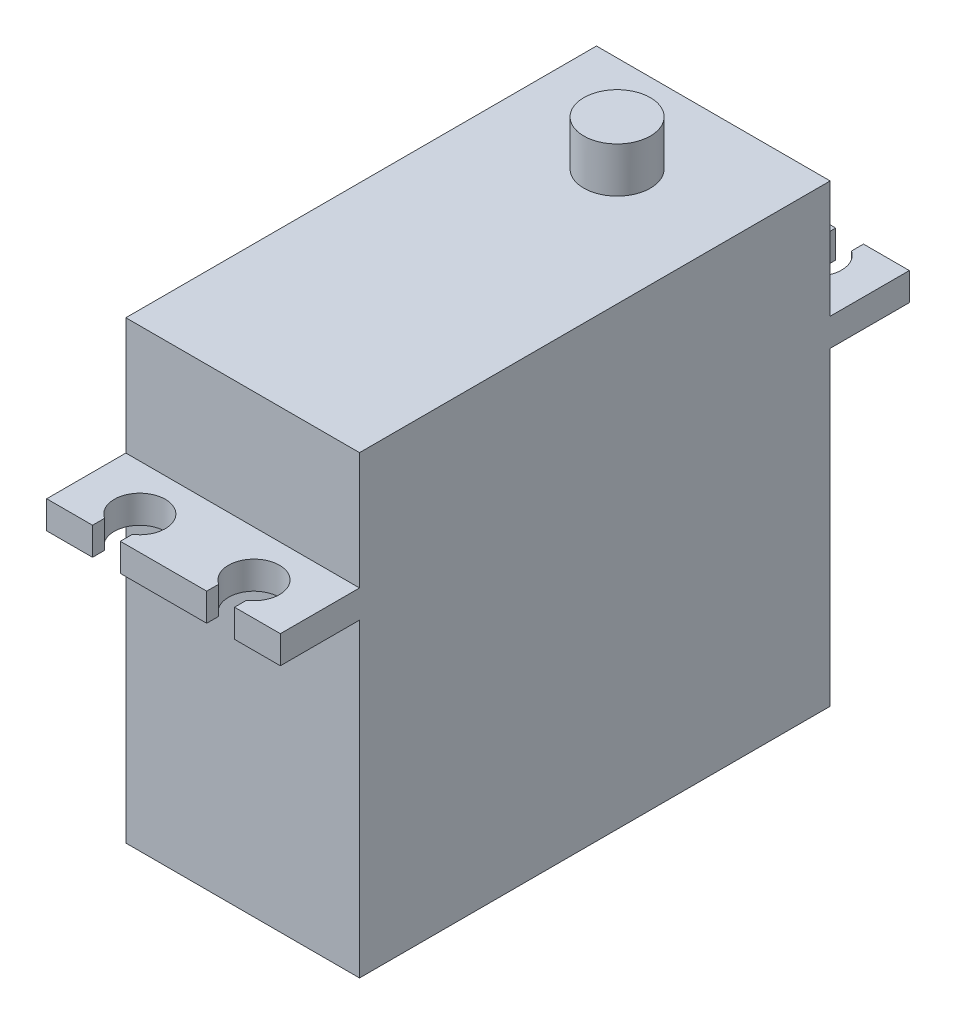
ISO-10303-21;
HEADER;
FILE_DESCRIPTION(('STEP AP214'),'2;1');
FILE_NAME('part.step','',(''),(''),'','','');
FILE_SCHEMA(('AUTOMOTIVE_DESIGN { 1 0 10303 214 1 1 1 1 }'));
ENDSEC;
DATA;
#1=APPLICATION_CONTEXT('core data for automotive mechanical design processes');
#2=APPLICATION_PROTOCOL_DEFINITION('international standard','automotive_design',2000,#1);
#3=PRODUCT_CONTEXT('',#1,'mechanical');
#4=PRODUCT('Part','Part','',(#3));
#5=PRODUCT_RELATED_PRODUCT_CATEGORY('part','',(#4));
#6=PRODUCT_DEFINITION_FORMATION('','',#4);
#7=PRODUCT_DEFINITION_CONTEXT('part definition',#1,'design');
#8=PRODUCT_DEFINITION('design','',#6,#7);
#9=PRODUCT_DEFINITION_SHAPE('','',#8);
#10=(LENGTH_UNIT() NAMED_UNIT(*) SI_UNIT(.MILLI.,.METRE.));
#11=(NAMED_UNIT(*) PLANE_ANGLE_UNIT() SI_UNIT($,.RADIAN.));
#12=(NAMED_UNIT(*) SI_UNIT($,.STERADIAN.) SOLID_ANGLE_UNIT());
#13=UNCERTAINTY_MEASURE_WITH_UNIT(LENGTH_MEASURE(1.E-05),#10,'distance_accuracy_value','');
#14=(GEOMETRIC_REPRESENTATION_CONTEXT(3) GLOBAL_UNCERTAINTY_ASSIGNED_CONTEXT((#13)) GLOBAL_UNIT_ASSIGNED_CONTEXT((#10,
#11,#12)) REPRESENTATION_CONTEXT('',''));
#15=CARTESIAN_POINT('',(0.,0.,0.));
#16=DIRECTION('',(0.,0.,1.));
#17=DIRECTION('',(1.,0.,0.));
#18=AXIS2_PLACEMENT_3D('',#15,#16,#17);
#19=CARTESIAN_POINT('',(10.08,39.25,-20.3));
#20=DIRECTION('',(0.,-1.,0.));
#21=DIRECTION('',(0.,0.,-1.));
#22=AXIS2_PLACEMENT_3D('',#19,#20,#21);
#23=PLANE('',#22);
#24=DIRECTION('',(0.,0.,1.));
#25=VECTOR('',#24,1.);
#26=CARTESIAN_POINT('',(-10.08,39.25,-20.3));
#27=LINE('',#26,#25);
#28=CARTESIAN_POINT('',(-10.08,39.25,-20.3));
#29=VERTEX_POINT('',#28);
#30=CARTESIAN_POINT('',(-10.08,39.25,20.3));
#31=VERTEX_POINT('',#30);
#32=EDGE_CURVE('E449',#29,#31,#27,.T.);
#33=ORIENTED_EDGE('',*,*,#32,.T.);
#34=DIRECTION('',(-1.,0.,0.));
#35=VECTOR('',#34,1.);
#36=CARTESIAN_POINT('',(10.08,39.25,20.3));
#37=LINE('',#36,#35);
#38=CARTESIAN_POINT('',(10.08,39.25,20.3));
#39=VERTEX_POINT('',#38);
#40=EDGE_CURVE('E465',#39,#31,#37,.T.);
#41=ORIENTED_EDGE('',*,*,#40,.F.);
#42=DIRECTION('',(0.,0.,1.));
#43=VECTOR('',#42,1.);
#44=CARTESIAN_POINT('',(10.08,39.25,-20.3));
#45=LINE('',#44,#43);
#46=CARTESIAN_POINT('',(10.08,39.25,-20.3));
#47=VERTEX_POINT('',#46);
#48=EDGE_CURVE('E437',#47,#39,#45,.T.);
#49=ORIENTED_EDGE('',*,*,#48,.F.);
#50=DIRECTION('',(-1.,0.,0.));
#51=VECTOR('',#50,1.);
#52=CARTESIAN_POINT('',(10.08,39.25,-20.3));
#53=LINE('',#52,#51);
#54=EDGE_CURVE('E40',#47,#29,#53,.T.);
#55=ORIENTED_EDGE('',*,*,#54,.T.);
#56=EDGE_LOOP('',(#33,#41,#49,#55));
#57=FACE_BOUND('',#56,.T.);
#58=CARTESIAN_POINT('',(0.,39.25,-12.));
#59=DIRECTION('',(0.,-1.,0.));
#60=DIRECTION('',(0.,0.,-1.));
#61=AXIS2_PLACEMENT_3D('',#58,#59,#60);
#62=CIRCLE('',#61,2.87);
#63=CARTESIAN_POINT('',(0.,39.25,-14.87));
#64=VERTEX_POINT('',#63);
#65=EDGE_CURVE('E11',#64,#64,#62,.F.);
#66=ORIENTED_EDGE('',*,*,#65,.F.);
#67=EDGE_LOOP('',(#66));
#68=FACE_BOUND('',#67,.T.);
#69=ADVANCED_FACE('F32',(#57,#68),#23,.F.);
#70=CARTESIAN_POINT('',(10.08,0.,-20.3));
#71=DIRECTION('',(0.,0.,1.));
#72=DIRECTION('',(1.,0.,0.));
#73=AXIS2_PLACEMENT_3D('',#70,#71,#72);
#74=PLANE('',#73);
#75=DIRECTION('',(-1.,0.,0.));
#76=VECTOR('',#75,1.);
#77=CARTESIAN_POINT('',(-10.08,26.74,-20.3));
#78=LINE('',#77,#76);
#79=CARTESIAN_POINT('',(10.08,26.74,-20.3));
#80=VERTEX_POINT('',#79);
#81=CARTESIAN_POINT('',(-10.08,26.74,-20.3));
#82=VERTEX_POINT('',#81);
#83=EDGE_CURVE('E276',#80,#82,#78,.T.);
#84=ORIENTED_EDGE('',*,*,#83,.F.);
#85=DIRECTION('',(0.,1.,0.));
#86=VECTOR('',#85,1.);
#87=CARTESIAN_POINT('',(10.08,0.,-20.3));
#88=LINE('',#87,#86);
#89=CARTESIAN_POINT('',(10.08,0.,-20.3));
#90=VERTEX_POINT('',#89);
#91=EDGE_CURVE('E439',#90,#80,#88,.T.);
#92=ORIENTED_EDGE('',*,*,#91,.F.);
#93=DIRECTION('',(-1.,0.,0.));
#94=VECTOR('',#93,1.);
#95=CARTESIAN_POINT('',(10.08,0.,-20.3));
#96=LINE('',#95,#94);
#97=CARTESIAN_POINT('',(-10.08,0.,-20.3));
#98=VERTEX_POINT('',#97);
#99=EDGE_CURVE('E470',#90,#98,#96,.T.);
#100=ORIENTED_EDGE('',*,*,#99,.T.);
#101=DIRECTION('',(0.,1.,0.));
#102=VECTOR('',#101,1.);
#103=CARTESIAN_POINT('',(-10.08,0.,-20.3));
#104=LINE('',#103,#102);
#105=EDGE_CURVE('E444',#98,#82,#104,.T.);
#106=ORIENTED_EDGE('',*,*,#105,.T.);
#107=EDGE_LOOP('',(#84,#92,#100,#106));
#108=FACE_BOUND('',#107,.T.);
#109=DIRECTION('',(0.,1.,0.));
#110=VECTOR('',#109,1.);
#111=CARTESIAN_POINT('',(-3.2,7.57434940805922,-20.3));
#112=LINE('',#111,#110);
#113=CARTESIAN_POINT('',(-3.2,3.47434940805923,-20.3));
#114=VERTEX_POINT('',#113);
#115=CARTESIAN_POINT('',(-3.2,7.57434940805922,-20.3));
#116=VERTEX_POINT('',#115);
#117=EDGE_CURVE('E261',#114,#116,#112,.T.);
#118=ORIENTED_EDGE('',*,*,#117,.F.);
#119=DIRECTION('',(-1.,0.,0.));
#120=VECTOR('',#119,1.);
#121=CARTESIAN_POINT('',(-3.2,3.47434940805923,-20.3));
#122=LINE('',#121,#120);
#123=CARTESIAN_POINT('',(3.2,3.47434940805922,-20.3));
#124=VERTEX_POINT('',#123);
#125=EDGE_CURVE('E258',#124,#114,#122,.T.);
#126=ORIENTED_EDGE('',*,*,#125,.F.);
#127=DIRECTION('',(0.,-1.,0.));
#128=VECTOR('',#127,1.);
#129=CARTESIAN_POINT('',(3.2,7.57434940805922,-20.3));
#130=LINE('',#129,#128);
#131=CARTESIAN_POINT('',(3.2,7.57434940805922,-20.3));
#132=VERTEX_POINT('',#131);
#133=EDGE_CURVE('E52',#132,#124,#130,.T.);
#134=ORIENTED_EDGE('',*,*,#133,.F.);
#135=DIRECTION('',(1.,0.,0.));
#136=VECTOR('',#135,1.);
#137=CARTESIAN_POINT('',(-3.2,7.57434940805922,-20.3));
#138=LINE('',#137,#136);
#139=EDGE_CURVE('E47',#116,#132,#138,.T.);
#140=ORIENTED_EDGE('',*,*,#139,.F.);
#141=EDGE_LOOP('',(#118,#126,#134,#140));
#142=FACE_BOUND('',#141,.T.);
#143=ADVANCED_FACE('F564',(#108,#142),#74,.F.);
#144=CARTESIAN_POINT('',(10.08,0.,20.3));
#145=DIRECTION('',(0.,0.,-1.));
#146=DIRECTION('',(-1.,0.,0.));
#147=AXIS2_PLACEMENT_3D('',#144,#145,#146);
#148=PLANE('',#147);
#149=DIRECTION('',(-1.,0.,0.));
#150=VECTOR('',#149,1.);
#151=CARTESIAN_POINT('',(-10.08,29.14,20.3));
#152=LINE('',#151,#150);
#153=CARTESIAN_POINT('',(10.08,29.14,20.3));
#154=VERTEX_POINT('',#153);
#155=CARTESIAN_POINT('',(-10.08,29.14,20.3));
#156=VERTEX_POINT('',#155);
#157=EDGE_CURVE('E397',#154,#156,#152,.T.);
#158=ORIENTED_EDGE('',*,*,#157,.F.);
#159=DIRECTION('',(0.,-1.,0.));
#160=VECTOR('',#159,1.);
#161=CARTESIAN_POINT('',(10.08,0.,20.3));
#162=LINE('',#161,#160);
#163=EDGE_CURVE('E476',#39,#154,#162,.T.);
#164=ORIENTED_EDGE('',*,*,#163,.F.);
#165=ORIENTED_EDGE('',*,*,#40,.T.);
#166=DIRECTION('',(0.,-1.,0.));
#167=VECTOR('',#166,1.);
#168=CARTESIAN_POINT('',(-10.08,0.,20.3));
#169=LINE('',#168,#167);
#170=EDGE_CURVE('E460',#31,#156,#169,.T.);
#171=ORIENTED_EDGE('',*,*,#170,.T.);
#172=EDGE_LOOP('',(#158,#164,#165,#171));
#173=FACE_BOUND('',#172,.T.);
#174=ADVANCED_FACE('F496',(#173),#148,.F.);
#175=CARTESIAN_POINT('',(10.08,29.14,-20.3));
#176=VERTEX_POINT('',#175);
#177=EDGE_CURVE('E282',#176,#47,#88,.T.);
#178=ORIENTED_EDGE('',*,*,#177,.F.);
#179=DIRECTION('',(-1.,0.,0.));
#180=VECTOR('',#179,1.);
#181=CARTESIAN_POINT('',(-10.08,29.14,-20.3));
#182=LINE('',#181,#180);
#183=CARTESIAN_POINT('',(-10.08,29.14,-20.3));
#184=VERTEX_POINT('',#183);
#185=EDGE_CURVE('E265',#176,#184,#182,.T.);
#186=ORIENTED_EDGE('',*,*,#185,.T.);
#187=EDGE_CURVE('E418',#184,#29,#104,.T.);
#188=ORIENTED_EDGE('',*,*,#187,.T.);
#189=ORIENTED_EDGE('',*,*,#54,.F.);
#190=EDGE_LOOP('',(#178,#186,#188,#189));
#191=FACE_BOUND('',#190,.T.);
#192=ADVANCED_FACE('F34',(#191),#74,.F.);
#193=CARTESIAN_POINT('',(10.08,26.74,20.3));
#194=VERTEX_POINT('',#193);
#195=CARTESIAN_POINT('',(10.08,0.,20.3));
#196=VERTEX_POINT('',#195);
#197=EDGE_CURVE('E392',#194,#196,#162,.T.);
#198=ORIENTED_EDGE('',*,*,#197,.F.);
#199=DIRECTION('',(-1.,0.,0.));
#200=VECTOR('',#199,1.);
#201=CARTESIAN_POINT('',(-10.08,26.74,20.3));
#202=LINE('',#201,#200);
#203=CARTESIAN_POINT('',(-10.08,26.74,20.3));
#204=VERTEX_POINT('',#203);
#205=EDGE_CURVE('E387',#194,#204,#202,.T.);
#206=ORIENTED_EDGE('',*,*,#205,.T.);
#207=CARTESIAN_POINT('',(-10.08,0.,20.3));
#208=VERTEX_POINT('',#207);
#209=EDGE_CURVE('E452',#204,#208,#169,.T.);
#210=ORIENTED_EDGE('',*,*,#209,.T.);
#211=DIRECTION('',(-1.,0.,0.));
#212=VECTOR('',#211,1.);
#213=CARTESIAN_POINT('',(10.08,0.,20.3));
#214=LINE('',#213,#212);
#215=EDGE_CURVE('E468',#196,#208,#214,.T.);
#216=ORIENTED_EDGE('',*,*,#215,.F.);
#217=EDGE_LOOP('',(#198,#206,#210,#216));
#218=FACE_BOUND('',#217,.T.);
#219=ADVANCED_FACE('F561',(#218),#148,.F.);
#220=CARTESIAN_POINT('',(10.08,0.,-20.3));
#221=DIRECTION('',(0.,1.,0.));
#222=DIRECTION('',(0.,0.,1.));
#223=AXIS2_PLACEMENT_3D('',#220,#221,#222);
#224=PLANE('',#223);
#225=DIRECTION('',(0.,0.,-1.));
#226=VECTOR('',#225,1.);
#227=CARTESIAN_POINT('',(-10.08,0.,-20.3));
#228=LINE('',#227,#226);
#229=EDGE_CURVE('E455',#208,#98,#228,.T.);
#230=ORIENTED_EDGE('',*,*,#229,.T.);
#231=ORIENTED_EDGE('',*,*,#99,.F.);
#232=DIRECTION('',(0.,0.,-1.));
#233=VECTOR('',#232,1.);
#234=CARTESIAN_POINT('',(10.08,0.,-20.3));
#235=LINE('',#234,#233);
#236=EDGE_CURVE('E448',#196,#90,#235,.T.);
#237=ORIENTED_EDGE('',*,*,#236,.F.);
#238=ORIENTED_EDGE('',*,*,#215,.T.);
#239=EDGE_LOOP('',(#230,#231,#237,#238));
#240=FACE_BOUND('',#239,.T.);
#241=ADVANCED_FACE('F563',(#240),#224,.F.);
#242=CARTESIAN_POINT('',(10.08,0.,0.));
#243=DIRECTION('',(1.,0.,0.));
#244=DIRECTION('',(0.,0.,-1.));
#245=AXIS2_PLACEMENT_3D('',#242,#243,#244);
#246=PLANE('',#245);
#247=ORIENTED_EDGE('',*,*,#91,.T.);
#248=DIRECTION('',(0.,0.,1.));
#249=VECTOR('',#248,1.);
#250=CARTESIAN_POINT('',(10.08,26.74,-20.3));
#251=LINE('',#250,#249);
#252=CARTESIAN_POINT('',(10.08,26.74,-27.13));
#253=VERTEX_POINT('',#252);
#254=EDGE_CURVE('E280',#253,#80,#251,.T.);
#255=ORIENTED_EDGE('',*,*,#254,.F.);
#256=DIRECTION('',(0.,1.,0.));
#257=VECTOR('',#256,1.);
#258=CARTESIAN_POINT('',(10.08,26.74,-27.13));
#259=LINE('',#258,#257);
#260=CARTESIAN_POINT('',(10.08,29.14,-27.13));
#261=VERTEX_POINT('',#260);
#262=EDGE_CURVE('E350',#253,#261,#259,.T.);
#263=ORIENTED_EDGE('',*,*,#262,.T.);
#264=DIRECTION('',(0.,0.,1.));
#265=VECTOR('',#264,1.);
#266=CARTESIAN_POINT('',(10.08,29.14,-20.3));
#267=LINE('',#266,#265);
#268=EDGE_CURVE('E294',#261,#176,#267,.T.);
#269=ORIENTED_EDGE('',*,*,#268,.T.);
#270=ORIENTED_EDGE('',*,*,#177,.T.);
#271=ORIENTED_EDGE('',*,*,#48,.T.);
#272=ORIENTED_EDGE('',*,*,#163,.T.);
#273=DIRECTION('',(0.,0.,-1.));
#274=VECTOR('',#273,1.);
#275=CARTESIAN_POINT('',(10.08,29.14,20.3));
#276=LINE('',#275,#274);
#277=CARTESIAN_POINT('',(10.08,29.14,27.13));
#278=VERTEX_POINT('',#277);
#279=EDGE_CURVE('E403',#278,#154,#276,.T.);
#280=ORIENTED_EDGE('',*,*,#279,.F.);
#281=DIRECTION('',(0.,1.,0.));
#282=VECTOR('',#281,1.);
#283=CARTESIAN_POINT('',(10.08,26.74,27.13));
#284=LINE('',#283,#282);
#285=CARTESIAN_POINT('',(10.08,26.74,27.13));
#286=VERTEX_POINT('',#285);
#287=EDGE_CURVE('E416',#286,#278,#284,.T.);
#288=ORIENTED_EDGE('',*,*,#287,.F.);
#289=DIRECTION('',(0.,0.,-1.));
#290=VECTOR('',#289,1.);
#291=CARTESIAN_POINT('',(10.08,26.74,20.3));
#292=LINE('',#291,#290);
#293=EDGE_CURVE('E381',#286,#194,#292,.T.);
#294=ORIENTED_EDGE('',*,*,#293,.T.);
#295=ORIENTED_EDGE('',*,*,#197,.T.);
#296=ORIENTED_EDGE('',*,*,#236,.T.);
#297=EDGE_LOOP('',(#247,#255,#263,#269,#270,#271,#272,#280,#288,#294,#295,#296));
#298=FACE_BOUND('',#297,.T.);
#299=ADVANCED_FACE('F488',(#298),#246,.T.);
#300=CARTESIAN_POINT('',(-10.08,0.,0.));
#301=DIRECTION('',(1.,0.,0.));
#302=DIRECTION('',(0.,0.,-1.));
#303=AXIS2_PLACEMENT_3D('',#300,#301,#302);
#304=PLANE('',#303);
#305=ORIENTED_EDGE('',*,*,#105,.F.);
#306=ORIENTED_EDGE('',*,*,#229,.F.);
#307=ORIENTED_EDGE('',*,*,#209,.F.);
#308=DIRECTION('',(0.,0.,1.));
#309=VECTOR('',#308,1.);
#310=CARTESIAN_POINT('',(-10.08,26.74,20.3));
#311=LINE('',#310,#309);
#312=CARTESIAN_POINT('',(-10.08,26.74,27.13));
#313=VERTEX_POINT('',#312);
#314=EDGE_CURVE('E357',#204,#313,#311,.T.);
#315=ORIENTED_EDGE('',*,*,#314,.T.);
#316=DIRECTION('',(0.,1.,0.));
#317=VECTOR('',#316,1.);
#318=CARTESIAN_POINT('',(-10.08,26.74,27.13));
#319=LINE('',#318,#317);
#320=CARTESIAN_POINT('',(-10.08,29.14,27.13));
#321=VERTEX_POINT('',#320);
#322=EDGE_CURVE('E391',#313,#321,#319,.T.);
#323=ORIENTED_EDGE('',*,*,#322,.T.);
#324=DIRECTION('',(0.,0.,1.));
#325=VECTOR('',#324,1.);
#326=CARTESIAN_POINT('',(-10.08,29.14,20.3));
#327=LINE('',#326,#325);
#328=EDGE_CURVE('E325',#156,#321,#327,.T.);
#329=ORIENTED_EDGE('',*,*,#328,.F.);
#330=ORIENTED_EDGE('',*,*,#170,.F.);
#331=ORIENTED_EDGE('',*,*,#32,.F.);
#332=ORIENTED_EDGE('',*,*,#187,.F.);
#333=DIRECTION('',(0.,0.,-1.));
#334=VECTOR('',#333,1.);
#335=CARTESIAN_POINT('',(-10.08,29.14,-20.3));
#336=LINE('',#335,#334);
#337=CARTESIAN_POINT('',(-10.08,29.14,-27.13));
#338=VERTEX_POINT('',#337);
#339=EDGE_CURVE('E262',#184,#338,#336,.T.);
#340=ORIENTED_EDGE('',*,*,#339,.T.);
#341=DIRECTION('',(0.,1.,0.));
#342=VECTOR('',#341,1.);
#343=CARTESIAN_POINT('',(-10.08,26.74,-27.13));
#344=LINE('',#343,#342);
#345=CARTESIAN_POINT('',(-10.08,26.74,-27.13));
#346=VERTEX_POINT('',#345);
#347=EDGE_CURVE('E322',#346,#338,#344,.T.);
#348=ORIENTED_EDGE('',*,*,#347,.F.);
#349=DIRECTION('',(0.,0.,-1.));
#350=VECTOR('',#349,1.);
#351=CARTESIAN_POINT('',(-10.08,26.74,-20.3));
#352=LINE('',#351,#350);
#353=EDGE_CURVE('E281',#82,#346,#352,.T.);
#354=ORIENTED_EDGE('',*,*,#353,.F.);
#355=EDGE_LOOP('',(#305,#306,#307,#315,#323,#329,#330,#331,#332,#340,#348,#354));
#356=FACE_BOUND('',#355,.T.);
#357=ADVANCED_FACE('F557',(#356),#304,.F.);
#358=CARTESIAN_POINT('',(6.12461360595412,26.74,27.13));
#359=DIRECTION('',(0.,0.,1.));
#360=DIRECTION('',(1.,0.,0.));
#361=AXIS2_PLACEMENT_3D('',#358,#359,#360);
#362=PLANE('',#361);
#363=DIRECTION('',(1.,0.,0.));
#364=VECTOR('',#363,1.);
#365=CARTESIAN_POINT('',(6.12461360595412,29.14,27.13));
#366=LINE('',#365,#364);
#367=CARTESIAN_POINT('',(6.12461360595412,29.14,27.13));
#368=VERTEX_POINT('',#367);
#369=EDGE_CURVE('E405',#368,#278,#366,.T.);
#370=ORIENTED_EDGE('',*,*,#369,.F.);
#371=DIRECTION('',(0.,1.,0.));
#372=VECTOR('',#371,1.);
#373=CARTESIAN_POINT('',(6.12461360595412,26.74,27.13));
#374=LINE('',#373,#372);
#375=CARTESIAN_POINT('',(6.12461360595412,26.74,27.13));
#376=VERTEX_POINT('',#375);
#377=EDGE_CURVE('E419',#376,#368,#374,.T.);
#378=ORIENTED_EDGE('',*,*,#377,.F.);
#379=DIRECTION('',(1.,0.,0.));
#380=VECTOR('',#379,1.);
#381=CARTESIAN_POINT('',(6.12461360595412,26.74,27.13));
#382=LINE('',#381,#380);
#383=EDGE_CURVE('E378',#376,#286,#382,.T.);
#384=ORIENTED_EDGE('',*,*,#383,.T.);
#385=ORIENTED_EDGE('',*,*,#287,.T.);
#386=EDGE_LOOP('',(#370,#378,#384,#385));
#387=FACE_BOUND('',#386,.T.);
#388=ADVANCED_FACE('F511',(#387),#362,.T.);
#389=CARTESIAN_POINT('',(6.12461360595412,26.74,27.13));
#390=DIRECTION('',(-1.,0.,0.));
#391=DIRECTION('',(0.,0.,1.));
#392=AXIS2_PLACEMENT_3D('',#389,#390,#391);
#393=PLANE('',#392);
#394=DIRECTION('',(0.,0.,1.));
#395=VECTOR('',#394,1.);
#396=CARTESIAN_POINT('',(6.12461360595412,29.14,27.13));
#397=LINE('',#396,#395);
#398=CARTESIAN_POINT('',(6.12461360595412,29.14,26.094160295747));
#399=VERTEX_POINT('',#398);
#400=EDGE_CURVE('E515',#399,#368,#397,.T.);
#401=ORIENTED_EDGE('',*,*,#400,.F.);
#402=DIRECTION('',(0.,1.,0.));
#403=VECTOR('',#402,1.);
#404=CARTESIAN_POINT('',(6.12461360595412,26.74,26.094160295747));
#405=LINE('',#404,#403);
#406=CARTESIAN_POINT('',(6.12461360595412,26.74,26.094160295747));
#407=VERTEX_POINT('',#406);
#408=EDGE_CURVE('E421',#407,#399,#405,.T.);
#409=ORIENTED_EDGE('',*,*,#408,.F.);
#410=DIRECTION('',(0.,0.,1.));
#411=VECTOR('',#410,1.);
#412=CARTESIAN_POINT('',(6.12461360595412,26.74,27.13));
#413=LINE('',#412,#411);
#414=EDGE_CURVE('E375',#407,#376,#413,.T.);
#415=ORIENTED_EDGE('',*,*,#414,.T.);
#416=ORIENTED_EDGE('',*,*,#377,.T.);
#417=EDGE_LOOP('',(#401,#409,#415,#416));
#418=FACE_BOUND('',#417,.T.);
#419=ADVANCED_FACE('F514',(#418),#393,.T.);
#420=CARTESIAN_POINT('',(4.925,26.74,24.25));
#421=DIRECTION('',(0.,1.,0.));
#422=DIRECTION('',(0.,0.,1.));
#423=AXIS2_PLACEMENT_3D('',#420,#421,#422);
#424=CYLINDRICAL_SURFACE('',#423,2.2);
#425=CARTESIAN_POINT('',(4.925,29.14,24.25));
#426=DIRECTION('',(0.,-1.,0.));
#427=DIRECTION('',(0.,0.,1.));
#428=AXIS2_PLACEMENT_3D('',#425,#426,#427);
#429=CIRCLE('',#428,2.2);
#430=CARTESIAN_POINT('',(3.72538639404588,29.14,26.094160295747));
#431=VERTEX_POINT('',#430);
#432=EDGE_CURVE('E522',#431,#399,#429,.T.);
#433=ORIENTED_EDGE('',*,*,#432,.F.);
#434=DIRECTION('',(0.,1.,0.));
#435=VECTOR('',#434,1.);
#436=CARTESIAN_POINT('',(3.72538639404588,26.74,26.094160295747));
#437=LINE('',#436,#435);
#438=CARTESIAN_POINT('',(3.72538639404588,26.74,26.094160295747));
#439=VERTEX_POINT('',#438);
#440=EDGE_CURVE('E423',#439,#431,#437,.T.);
#441=ORIENTED_EDGE('',*,*,#440,.F.);
#442=CARTESIAN_POINT('',(4.925,26.74,24.25));
#443=DIRECTION('',(0.,-1.,0.));
#444=DIRECTION('',(0.,0.,1.));
#445=AXIS2_PLACEMENT_3D('',#442,#443,#444);
#446=CIRCLE('',#445,2.2);
#447=EDGE_CURVE('E372',#439,#407,#446,.T.);
#448=ORIENTED_EDGE('',*,*,#447,.T.);
#449=ORIENTED_EDGE('',*,*,#408,.T.);
#450=EDGE_LOOP('',(#433,#441,#448,#449));
#451=FACE_BOUND('',#450,.T.);
#452=ADVANCED_FACE('F521',(#451),#424,.F.);
#453=CARTESIAN_POINT('',(3.72538639404588,26.74,27.13));
#454=DIRECTION('',(1.,0.,0.));
#455=DIRECTION('',(0.,0.,-1.));
#456=AXIS2_PLACEMENT_3D('',#453,#454,#455);
#457=PLANE('',#456);
#458=DIRECTION('',(0.,0.,-1.));
#459=VECTOR('',#458,1.);
#460=CARTESIAN_POINT('',(3.72538639404588,29.14,27.13));
#461=LINE('',#460,#459);
#462=CARTESIAN_POINT('',(3.72538639404588,29.14,27.13));
#463=VERTEX_POINT('',#462);
#464=EDGE_CURVE('E527',#463,#431,#461,.T.);
#465=ORIENTED_EDGE('',*,*,#464,.F.);
#466=DIRECTION('',(0.,1.,0.));
#467=VECTOR('',#466,1.);
#468=CARTESIAN_POINT('',(3.72538639404588,26.74,27.13));
#469=LINE('',#468,#467);
#470=CARTESIAN_POINT('',(3.72538639404588,26.74,27.13));
#471=VERTEX_POINT('',#470);
#472=EDGE_CURVE('E425',#471,#463,#469,.T.);
#473=ORIENTED_EDGE('',*,*,#472,.F.);
#474=DIRECTION('',(0.,0.,-1.));
#475=VECTOR('',#474,1.);
#476=CARTESIAN_POINT('',(3.72538639404588,26.74,27.13));
#477=LINE('',#476,#475);
#478=EDGE_CURVE('E369',#471,#439,#477,.T.);
#479=ORIENTED_EDGE('',*,*,#478,.T.);
#480=ORIENTED_EDGE('',*,*,#440,.T.);
#481=EDGE_LOOP('',(#465,#473,#479,#480));
#482=FACE_BOUND('',#481,.T.);
#483=ADVANCED_FACE('F526',(#482),#457,.T.);
#484=CARTESIAN_POINT('',(-3.72538639404588,26.74,27.13));
#485=DIRECTION('',(0.,0.,1.));
#486=DIRECTION('',(1.,0.,0.));
#487=AXIS2_PLACEMENT_3D('',#484,#485,#486);
#488=PLANE('',#487);
#489=DIRECTION('',(1.,0.,0.));
#490=VECTOR('',#489,1.);
#491=CARTESIAN_POINT('',(-3.72538639404588,29.14,27.13));
#492=LINE('',#491,#490);
#493=CARTESIAN_POINT('',(-3.72538639404588,29.14,27.13));
#494=VERTEX_POINT('',#493);
#495=EDGE_CURVE('E534',#494,#463,#492,.T.);
#496=ORIENTED_EDGE('',*,*,#495,.F.);
#497=DIRECTION('',(0.,1.,0.));
#498=VECTOR('',#497,1.);
#499=CARTESIAN_POINT('',(-3.72538639404588,26.74,27.13));
#500=LINE('',#499,#498);
#501=CARTESIAN_POINT('',(-3.72538639404588,26.74,27.13));
#502=VERTEX_POINT('',#501);
#503=EDGE_CURVE('E427',#502,#494,#500,.T.);
#504=ORIENTED_EDGE('',*,*,#503,.F.);
#505=DIRECTION('',(1.,0.,0.));
#506=VECTOR('',#505,1.);
#507=CARTESIAN_POINT('',(-3.72538639404588,26.74,27.13));
#508=LINE('',#507,#506);
#509=EDGE_CURVE('E366',#502,#471,#508,.T.);
#510=ORIENTED_EDGE('',*,*,#509,.T.);
#511=ORIENTED_EDGE('',*,*,#472,.T.);
#512=EDGE_LOOP('',(#496,#504,#510,#511));
#513=FACE_BOUND('',#512,.T.);
#514=ADVANCED_FACE('F533',(#513),#488,.T.);
#515=CARTESIAN_POINT('',(-3.72538639404588,26.74,27.13));
#516=DIRECTION('',(-1.,0.,0.));
#517=DIRECTION('',(0.,0.,1.));
#518=AXIS2_PLACEMENT_3D('',#515,#516,#517);
#519=PLANE('',#518);
#520=DIRECTION('',(0.,0.,1.));
#521=VECTOR('',#520,1.);
#522=CARTESIAN_POINT('',(-3.72538639404588,29.14,27.13));
#523=LINE('',#522,#521);
#524=CARTESIAN_POINT('',(-3.72538639404588,29.14,26.094160295747));
#525=VERTEX_POINT('',#524);
#526=EDGE_CURVE('E539',#525,#494,#523,.T.);
#527=ORIENTED_EDGE('',*,*,#526,.F.);
#528=DIRECTION('',(0.,1.,0.));
#529=VECTOR('',#528,1.);
#530=CARTESIAN_POINT('',(-3.72538639404588,26.74,26.094160295747));
#531=LINE('',#530,#529);
#532=CARTESIAN_POINT('',(-3.72538639404588,26.74,26.094160295747));
#533=VERTEX_POINT('',#532);
#534=EDGE_CURVE('E429',#533,#525,#531,.T.);
#535=ORIENTED_EDGE('',*,*,#534,.F.);
#536=DIRECTION('',(0.,0.,1.));
#537=VECTOR('',#536,1.);
#538=CARTESIAN_POINT('',(-3.72538639404588,26.74,27.13));
#539=LINE('',#538,#537);
#540=EDGE_CURVE('E363',#533,#502,#539,.T.);
#541=ORIENTED_EDGE('',*,*,#540,.T.);
#542=ORIENTED_EDGE('',*,*,#503,.T.);
#543=EDGE_LOOP('',(#527,#535,#541,#542));
#544=FACE_BOUND('',#543,.T.);
#545=ADVANCED_FACE('F538',(#544),#519,.T.);
#546=CARTESIAN_POINT('',(-4.925,26.74,24.25));
#547=DIRECTION('',(0.,1.,0.));
#548=DIRECTION('',(0.,0.,1.));
#549=AXIS2_PLACEMENT_3D('',#546,#547,#548);
#550=CYLINDRICAL_SURFACE('',#549,2.2);
#551=CARTESIAN_POINT('',(-4.925,29.14,24.25));
#552=DIRECTION('',(0.,-1.,0.));
#553=DIRECTION('',(0.,0.,-1.));
#554=AXIS2_PLACEMENT_3D('',#551,#552,#553);
#555=CIRCLE('',#554,2.2);
#556=CARTESIAN_POINT('',(-6.12461360595412,29.14,26.094160295747));
#557=VERTEX_POINT('',#556);
#558=EDGE_CURVE('E546',#557,#525,#555,.T.);
#559=ORIENTED_EDGE('',*,*,#558,.F.);
#560=DIRECTION('',(0.,1.,0.));
#561=VECTOR('',#560,1.);
#562=CARTESIAN_POINT('',(-6.12461360595412,26.74,26.094160295747));
#563=LINE('',#562,#561);
#564=CARTESIAN_POINT('',(-6.12461360595412,26.74,26.094160295747));
#565=VERTEX_POINT('',#564);
#566=EDGE_CURVE('E431',#565,#557,#563,.T.);
#567=ORIENTED_EDGE('',*,*,#566,.F.);
#568=CARTESIAN_POINT('',(-4.925,26.74,24.25));
#569=DIRECTION('',(0.,-1.,0.));
#570=DIRECTION('',(0.,0.,-1.));
#571=AXIS2_PLACEMENT_3D('',#568,#569,#570);
#572=CIRCLE('',#571,2.2);
#573=EDGE_CURVE('E360',#565,#533,#572,.T.);
#574=ORIENTED_EDGE('',*,*,#573,.T.);
#575=ORIENTED_EDGE('',*,*,#534,.T.);
#576=EDGE_LOOP('',(#559,#567,#574,#575));
#577=FACE_BOUND('',#576,.T.);
#578=ADVANCED_FACE('F545',(#577),#550,.F.);
#579=CARTESIAN_POINT('',(-6.12461360595412,26.74,27.13));
#580=DIRECTION('',(1.,0.,0.));
#581=DIRECTION('',(0.,0.,-1.));
#582=AXIS2_PLACEMENT_3D('',#579,#580,#581);
#583=PLANE('',#582);
#584=DIRECTION('',(0.,0.,-1.));
#585=VECTOR('',#584,1.);
#586=CARTESIAN_POINT('',(-6.12461360595412,29.14,27.13));
#587=LINE('',#586,#585);
#588=CARTESIAN_POINT('',(-6.12461360595412,29.14,27.13));
#589=VERTEX_POINT('',#588);
#590=EDGE_CURVE('E551',#589,#557,#587,.T.);
#591=ORIENTED_EDGE('',*,*,#590,.F.);
#592=DIRECTION('',(0.,1.,0.));
#593=VECTOR('',#592,1.);
#594=CARTESIAN_POINT('',(-6.12461360595412,26.74,27.13));
#595=LINE('',#594,#593);
#596=CARTESIAN_POINT('',(-6.12461360595412,26.74,27.13));
#597=VERTEX_POINT('',#596);
#598=EDGE_CURVE('E433',#597,#589,#595,.T.);
#599=ORIENTED_EDGE('',*,*,#598,.F.);
#600=DIRECTION('',(0.,0.,-1.));
#601=VECTOR('',#600,1.);
#602=CARTESIAN_POINT('',(-6.12461360595412,26.74,27.13));
#603=LINE('',#602,#601);
#604=EDGE_CURVE('E356',#597,#565,#603,.T.);
#605=ORIENTED_EDGE('',*,*,#604,.T.);
#606=ORIENTED_EDGE('',*,*,#566,.T.);
#607=EDGE_LOOP('',(#591,#599,#605,#606));
#608=FACE_BOUND('',#607,.T.);
#609=ADVANCED_FACE('F550',(#608),#583,.T.);
#610=CARTESIAN_POINT('',(-10.08,26.74,27.13));
#611=DIRECTION('',(0.,0.,1.));
#612=DIRECTION('',(1.,0.,0.));
#613=AXIS2_PLACEMENT_3D('',#610,#611,#612);
#614=PLANE('',#613);
#615=DIRECTION('',(1.,0.,0.));
#616=VECTOR('',#615,1.);
#617=CARTESIAN_POINT('',(-10.08,29.14,27.13));
#618=LINE('',#617,#616);
#619=EDGE_CURVE('E384',#321,#589,#618,.T.);
#620=ORIENTED_EDGE('',*,*,#619,.F.);
#621=ORIENTED_EDGE('',*,*,#322,.F.);
#622=DIRECTION('',(1.,0.,0.));
#623=VECTOR('',#622,1.);
#624=CARTESIAN_POINT('',(-10.08,26.74,27.13));
#625=LINE('',#624,#623);
#626=EDGE_CURVE('E353',#313,#597,#625,.T.);
#627=ORIENTED_EDGE('',*,*,#626,.T.);
#628=ORIENTED_EDGE('',*,*,#598,.T.);
#629=EDGE_LOOP('',(#620,#621,#627,#628));
#630=FACE_BOUND('',#629,.T.);
#631=ADVANCED_FACE('F555',(#630),#614,.T.);
#632=CARTESIAN_POINT('',(-4.925,26.74,24.25));
#633=DIRECTION('',(0.,-1.,0.));
#634=DIRECTION('',(0.,0.,-1.));
#635=AXIS2_PLACEMENT_3D('',#632,#633,#634);
#636=PLANE('',#635);
#637=ORIENTED_EDGE('',*,*,#314,.F.);
#638=ORIENTED_EDGE('',*,*,#205,.F.);
#639=ORIENTED_EDGE('',*,*,#293,.F.);
#640=ORIENTED_EDGE('',*,*,#383,.F.);
#641=ORIENTED_EDGE('',*,*,#414,.F.);
#642=ORIENTED_EDGE('',*,*,#447,.F.);
#643=ORIENTED_EDGE('',*,*,#478,.F.);
#644=ORIENTED_EDGE('',*,*,#509,.F.);
#645=ORIENTED_EDGE('',*,*,#540,.F.);
#646=ORIENTED_EDGE('',*,*,#573,.F.);
#647=ORIENTED_EDGE('',*,*,#604,.F.);
#648=ORIENTED_EDGE('',*,*,#626,.F.);
#649=EDGE_LOOP('',(#637,#638,#639,#640,#641,#642,#643,#644,#645,#646,#647,#648));
#650=FACE_BOUND('',#649,.T.);
#651=ADVANCED_FACE('F509',(#650),#636,.T.);
#652=CARTESIAN_POINT('',(-4.925,29.14,24.25));
#653=DIRECTION('',(0.,-1.,0.));
#654=DIRECTION('',(0.,0.,-1.));
#655=AXIS2_PLACEMENT_3D('',#652,#653,#654);
#656=PLANE('',#655);
#657=ORIENTED_EDGE('',*,*,#328,.T.);
#658=ORIENTED_EDGE('',*,*,#619,.T.);
#659=ORIENTED_EDGE('',*,*,#590,.T.);
#660=ORIENTED_EDGE('',*,*,#558,.T.);
#661=ORIENTED_EDGE('',*,*,#526,.T.);
#662=ORIENTED_EDGE('',*,*,#495,.T.);
#663=ORIENTED_EDGE('',*,*,#464,.T.);
#664=ORIENTED_EDGE('',*,*,#432,.T.);
#665=ORIENTED_EDGE('',*,*,#400,.T.);
#666=ORIENTED_EDGE('',*,*,#369,.T.);
#667=ORIENTED_EDGE('',*,*,#279,.T.);
#668=ORIENTED_EDGE('',*,*,#157,.T.);
#669=EDGE_LOOP('',(#657,#658,#659,#660,#661,#662,#663,#664,#665,#666,#667,#668));
#670=FACE_BOUND('',#669,.T.);
#671=ADVANCED_FACE('F499',(#670),#656,.F.);
#672=CARTESIAN_POINT('',(-10.08,26.74,-27.13));
#673=DIRECTION('',(0.,0.,1.));
#674=DIRECTION('',(1.,0.,0.));
#675=AXIS2_PLACEMENT_3D('',#672,#673,#674);
#676=PLANE('',#675);
#677=DIRECTION('',(1.,0.,0.));
#678=VECTOR('',#677,1.);
#679=CARTESIAN_POINT('',(-10.08,29.14,-27.13));
#680=LINE('',#679,#678);
#681=CARTESIAN_POINT('',(-6.12461360595412,29.14,-27.13));
#682=VERTEX_POINT('',#681);
#683=EDGE_CURVE('E287',#338,#682,#680,.T.);
#684=ORIENTED_EDGE('',*,*,#683,.T.);
#685=DIRECTION('',(0.,1.,0.));
#686=VECTOR('',#685,1.);
#687=CARTESIAN_POINT('',(-6.12461360595412,26.74,-27.13));
#688=LINE('',#687,#686);
#689=CARTESIAN_POINT('',(-6.12461360595412,26.74,-27.13));
#690=VERTEX_POINT('',#689);
#691=EDGE_CURVE('E326',#690,#682,#688,.T.);
#692=ORIENTED_EDGE('',*,*,#691,.F.);
#693=DIRECTION('',(1.,0.,0.));
#694=VECTOR('',#693,1.);
#695=CARTESIAN_POINT('',(-10.08,26.74,-27.13));
#696=LINE('',#695,#694);
#697=EDGE_CURVE('E304',#346,#690,#696,.T.);
#698=ORIENTED_EDGE('',*,*,#697,.F.);
#699=ORIENTED_EDGE('',*,*,#347,.T.);
#700=EDGE_LOOP('',(#684,#692,#698,#699));
#701=FACE_BOUND('',#700,.T.);
#702=ADVANCED_FACE('F587',(#701),#676,.F.);
#703=CARTESIAN_POINT('',(-6.12461360595412,26.74,-27.13));
#704=DIRECTION('',(-1.,0.,0.));
#705=DIRECTION('',(0.,0.,1.));
#706=AXIS2_PLACEMENT_3D('',#703,#704,#705);
#707=PLANE('',#706);
#708=DIRECTION('',(0.,0.,1.));
#709=VECTOR('',#708,1.);
#710=CARTESIAN_POINT('',(-6.12461360595412,29.14,-27.13));
#711=LINE('',#710,#709);
#712=CARTESIAN_POINT('',(-6.12461360595412,29.14,-26.094160295747));
#713=VERTEX_POINT('',#712);
#714=EDGE_CURVE('E319',#682,#713,#711,.T.);
#715=ORIENTED_EDGE('',*,*,#714,.T.);
#716=DIRECTION('',(0.,1.,0.));
#717=VECTOR('',#716,1.);
#718=CARTESIAN_POINT('',(-6.12461360595412,26.74,-26.094160295747));
#719=LINE('',#718,#717);
#720=CARTESIAN_POINT('',(-6.12461360595412,26.74,-26.094160295747));
#721=VERTEX_POINT('',#720);
#722=EDGE_CURVE('E329',#721,#713,#719,.T.);
#723=ORIENTED_EDGE('',*,*,#722,.F.);
#724=DIRECTION('',(0.,0.,1.));
#725=VECTOR('',#724,1.);
#726=CARTESIAN_POINT('',(-6.12461360595412,26.74,-27.13));
#727=LINE('',#726,#725);
#728=EDGE_CURVE('E590',#690,#721,#727,.T.);
#729=ORIENTED_EDGE('',*,*,#728,.F.);
#730=ORIENTED_EDGE('',*,*,#691,.T.);
#731=EDGE_LOOP('',(#715,#723,#729,#730));
#732=FACE_BOUND('',#731,.T.);
#733=ADVANCED_FACE('F631',(#732),#707,.F.);
#734=CARTESIAN_POINT('',(-4.925,26.74,-24.25));
#735=DIRECTION('',(0.,1.,0.));
#736=DIRECTION('',(0.,0.,1.));
#737=AXIS2_PLACEMENT_3D('',#734,#735,#736);
#738=CYLINDRICAL_SURFACE('',#737,2.2);
#739=CARTESIAN_POINT('',(-4.925,29.14,-24.25));
#740=DIRECTION('',(0.,1.,0.));
#741=DIRECTION('',(0.,0.,1.));
#742=AXIS2_PLACEMENT_3D('',#739,#740,#741);
#743=CIRCLE('',#742,2.2);
#744=CARTESIAN_POINT('',(-3.72538639404588,29.14,-26.094160295747));
#745=VERTEX_POINT('',#744);
#746=EDGE_CURVE('E317',#713,#745,#743,.T.);
#747=ORIENTED_EDGE('',*,*,#746,.T.);
#748=DIRECTION('',(0.,1.,0.));
#749=VECTOR('',#748,1.);
#750=CARTESIAN_POINT('',(-3.72538639404588,26.74,-26.094160295747));
#751=LINE('',#750,#749);
#752=CARTESIAN_POINT('',(-3.72538639404588,26.74,-26.094160295747));
#753=VERTEX_POINT('',#752);
#754=EDGE_CURVE('E332',#753,#745,#751,.T.);
#755=ORIENTED_EDGE('',*,*,#754,.F.);
#756=CARTESIAN_POINT('',(-4.925,26.74,-24.25));
#757=DIRECTION('',(0.,1.,0.));
#758=DIRECTION('',(0.,0.,1.));
#759=AXIS2_PLACEMENT_3D('',#756,#757,#758);
#760=CIRCLE('',#759,2.2);
#761=EDGE_CURVE('E591',#721,#753,#760,.T.);
#762=ORIENTED_EDGE('',*,*,#761,.F.);
#763=ORIENTED_EDGE('',*,*,#722,.T.);
#764=EDGE_LOOP('',(#747,#755,#762,#763));
#765=FACE_BOUND('',#764,.T.);
#766=ADVANCED_FACE('F628',(#765),#738,.F.);
#767=CARTESIAN_POINT('',(-3.72538639404588,26.74,-27.13));
#768=DIRECTION('',(1.,0.,0.));
#769=DIRECTION('',(0.,0.,-1.));
#770=AXIS2_PLACEMENT_3D('',#767,#768,#769);
#771=PLANE('',#770);
#772=DIRECTION('',(0.,0.,-1.));
#773=VECTOR('',#772,1.);
#774=CARTESIAN_POINT('',(-3.72538639404588,29.14,-27.13));
#775=LINE('',#774,#773);
#776=CARTESIAN_POINT('',(-3.72538639404588,29.14,-27.13));
#777=VERTEX_POINT('',#776);
#778=EDGE_CURVE('E315',#745,#777,#775,.T.);
#779=ORIENTED_EDGE('',*,*,#778,.T.);
#780=DIRECTION('',(0.,1.,0.));
#781=VECTOR('',#780,1.);
#782=CARTESIAN_POINT('',(-3.72538639404588,26.74,-27.13));
#783=LINE('',#782,#781);
#784=CARTESIAN_POINT('',(-3.72538639404588,26.74,-27.13));
#785=VERTEX_POINT('',#784);
#786=EDGE_CURVE('E335',#785,#777,#783,.T.);
#787=ORIENTED_EDGE('',*,*,#786,.F.);
#788=DIRECTION('',(0.,0.,-1.));
#789=VECTOR('',#788,1.);
#790=CARTESIAN_POINT('',(-3.72538639404588,26.74,-27.13));
#791=LINE('',#790,#789);
#792=EDGE_CURVE('E593',#753,#785,#791,.T.);
#793=ORIENTED_EDGE('',*,*,#792,.F.);
#794=ORIENTED_EDGE('',*,*,#754,.T.);
#795=EDGE_LOOP('',(#779,#787,#793,#794));
#796=FACE_BOUND('',#795,.T.);
#797=ADVANCED_FACE('F623',(#796),#771,.F.);
#798=CARTESIAN_POINT('',(-3.72538639404588,26.74,-27.13));
#799=DIRECTION('',(0.,0.,1.));
#800=DIRECTION('',(1.,0.,0.));
#801=AXIS2_PLACEMENT_3D('',#798,#799,#800);
#802=PLANE('',#801);
#803=DIRECTION('',(1.,0.,0.));
#804=VECTOR('',#803,1.);
#805=CARTESIAN_POINT('',(-3.72538639404588,29.14,-27.13));
#806=LINE('',#805,#804);
#807=CARTESIAN_POINT('',(3.72538639404588,29.14,-27.13));
#808=VERTEX_POINT('',#807);
#809=EDGE_CURVE('E313',#777,#808,#806,.T.);
#810=ORIENTED_EDGE('',*,*,#809,.T.);
#811=DIRECTION('',(0.,1.,0.));
#812=VECTOR('',#811,1.);
#813=CARTESIAN_POINT('',(3.72538639404588,26.74,-27.13));
#814=LINE('',#813,#812);
#815=CARTESIAN_POINT('',(3.72538639404588,26.74,-27.13));
#816=VERTEX_POINT('',#815);
#817=EDGE_CURVE('E338',#816,#808,#814,.T.);
#818=ORIENTED_EDGE('',*,*,#817,.F.);
#819=DIRECTION('',(1.,0.,0.));
#820=VECTOR('',#819,1.);
#821=CARTESIAN_POINT('',(-3.72538639404588,26.74,-27.13));
#822=LINE('',#821,#820);
#823=EDGE_CURVE('E597',#785,#816,#822,.T.);
#824=ORIENTED_EDGE('',*,*,#823,.F.);
#825=ORIENTED_EDGE('',*,*,#786,.T.);
#826=EDGE_LOOP('',(#810,#818,#824,#825));
#827=FACE_BOUND('',#826,.T.);
#828=ADVANCED_FACE('F619',(#827),#802,.F.);
#829=CARTESIAN_POINT('',(3.72538639404588,26.74,-27.13));
#830=DIRECTION('',(-1.,0.,0.));
#831=DIRECTION('',(0.,0.,1.));
#832=AXIS2_PLACEMENT_3D('',#829,#830,#831);
#833=PLANE('',#832);
#834=DIRECTION('',(0.,0.,1.));
#835=VECTOR('',#834,1.);
#836=CARTESIAN_POINT('',(3.72538639404588,29.14,-27.13));
#837=LINE('',#836,#835);
#838=CARTESIAN_POINT('',(3.72538639404588,29.14,-26.094160295747));
#839=VERTEX_POINT('',#838);
#840=EDGE_CURVE('E311',#808,#839,#837,.T.);
#841=ORIENTED_EDGE('',*,*,#840,.T.);
#842=DIRECTION('',(0.,1.,0.));
#843=VECTOR('',#842,1.);
#844=CARTESIAN_POINT('',(3.72538639404588,26.74,-26.094160295747));
#845=LINE('',#844,#843);
#846=CARTESIAN_POINT('',(3.72538639404588,26.74,-26.094160295747));
#847=VERTEX_POINT('',#846);
#848=EDGE_CURVE('E341',#847,#839,#845,.T.);
#849=ORIENTED_EDGE('',*,*,#848,.F.);
#850=DIRECTION('',(0.,0.,1.));
#851=VECTOR('',#850,1.);
#852=CARTESIAN_POINT('',(3.72538639404588,26.74,-27.13));
#853=LINE('',#852,#851);
#854=EDGE_CURVE('E599',#816,#847,#853,.T.);
#855=ORIENTED_EDGE('',*,*,#854,.F.);
#856=ORIENTED_EDGE('',*,*,#817,.T.);
#857=EDGE_LOOP('',(#841,#849,#855,#856));
#858=FACE_BOUND('',#857,.T.);
#859=ADVANCED_FACE('F615',(#858),#833,.F.);
#860=CARTESIAN_POINT('',(4.925,26.74,-24.25));
#861=DIRECTION('',(0.,1.,0.));
#862=DIRECTION('',(0.,0.,1.));
#863=AXIS2_PLACEMENT_3D('',#860,#861,#862);
#864=CYLINDRICAL_SURFACE('',#863,2.2);
#865=CARTESIAN_POINT('',(4.925,29.14,-24.25));
#866=DIRECTION('',(0.,1.,0.));
#867=DIRECTION('',(0.,0.,-1.));
#868=AXIS2_PLACEMENT_3D('',#865,#866,#867);
#869=CIRCLE('',#868,2.2);
#870=CARTESIAN_POINT('',(6.12461360595412,29.14,-26.094160295747));
#871=VERTEX_POINT('',#870);
#872=EDGE_CURVE('E309',#839,#871,#869,.T.);
#873=ORIENTED_EDGE('',*,*,#872,.T.);
#874=DIRECTION('',(0.,1.,0.));
#875=VECTOR('',#874,1.);
#876=CARTESIAN_POINT('',(6.12461360595412,26.74,-26.094160295747));
#877=LINE('',#876,#875);
#878=CARTESIAN_POINT('',(6.12461360595412,26.74,-26.094160295747));
#879=VERTEX_POINT('',#878);
#880=EDGE_CURVE('E344',#879,#871,#877,.T.);
#881=ORIENTED_EDGE('',*,*,#880,.F.);
#882=CARTESIAN_POINT('',(4.925,26.74,-24.25));
#883=DIRECTION('',(0.,1.,0.));
#884=DIRECTION('',(0.,0.,-1.));
#885=AXIS2_PLACEMENT_3D('',#882,#883,#884);
#886=CIRCLE('',#885,2.2);
#887=EDGE_CURVE('E601',#847,#879,#886,.T.);
#888=ORIENTED_EDGE('',*,*,#887,.F.);
#889=ORIENTED_EDGE('',*,*,#848,.T.);
#890=EDGE_LOOP('',(#873,#881,#888,#889));
#891=FACE_BOUND('',#890,.T.);
#892=ADVANCED_FACE('F607',(#891),#864,.F.);
#893=CARTESIAN_POINT('',(6.12461360595412,26.74,-27.13));
#894=DIRECTION('',(1.,0.,0.));
#895=DIRECTION('',(0.,0.,-1.));
#896=AXIS2_PLACEMENT_3D('',#893,#894,#895);
#897=PLANE('',#896);
#898=DIRECTION('',(0.,0.,-1.));
#899=VECTOR('',#898,1.);
#900=CARTESIAN_POINT('',(6.12461360595412,29.14,-27.13));
#901=LINE('',#900,#899);
#902=CARTESIAN_POINT('',(6.12461360595412,29.14,-27.13));
#903=VERTEX_POINT('',#902);
#904=EDGE_CURVE('E307',#871,#903,#901,.T.);
#905=ORIENTED_EDGE('',*,*,#904,.T.);
#906=DIRECTION('',(0.,1.,0.));
#907=VECTOR('',#906,1.);
#908=CARTESIAN_POINT('',(6.12461360595412,26.74,-27.13));
#909=LINE('',#908,#907);
#910=CARTESIAN_POINT('',(6.12461360595412,26.74,-27.13));
#911=VERTEX_POINT('',#910);
#912=EDGE_CURVE('E347',#911,#903,#909,.T.);
#913=ORIENTED_EDGE('',*,*,#912,.F.);
#914=DIRECTION('',(0.,0.,-1.));
#915=VECTOR('',#914,1.);
#916=CARTESIAN_POINT('',(6.12461360595412,26.74,-27.13));
#917=LINE('',#916,#915);
#918=EDGE_CURVE('E572',#879,#911,#917,.T.);
#919=ORIENTED_EDGE('',*,*,#918,.F.);
#920=ORIENTED_EDGE('',*,*,#880,.T.);
#921=EDGE_LOOP('',(#905,#913,#919,#920));
#922=FACE_BOUND('',#921,.T.);
#923=ADVANCED_FACE('F610',(#922),#897,.F.);
#924=CARTESIAN_POINT('',(6.12461360595412,26.74,-27.13));
#925=DIRECTION('',(0.,0.,1.));
#926=DIRECTION('',(1.,0.,0.));
#927=AXIS2_PLACEMENT_3D('',#924,#925,#926);
#928=PLANE('',#927);
#929=DIRECTION('',(1.,0.,0.));
#930=VECTOR('',#929,1.);
#931=CARTESIAN_POINT('',(6.12461360595412,29.14,-27.13));
#932=LINE('',#931,#930);
#933=EDGE_CURVE('E297',#903,#261,#932,.T.);
#934=ORIENTED_EDGE('',*,*,#933,.T.);
#935=ORIENTED_EDGE('',*,*,#262,.F.);
#936=DIRECTION('',(1.,0.,0.));
#937=VECTOR('',#936,1.);
#938=CARTESIAN_POINT('',(6.12461360595412,26.74,-27.13));
#939=LINE('',#938,#937);
#940=EDGE_CURVE('E273',#911,#253,#939,.T.);
#941=ORIENTED_EDGE('',*,*,#940,.F.);
#942=ORIENTED_EDGE('',*,*,#912,.T.);
#943=EDGE_LOOP('',(#934,#935,#941,#942));
#944=FACE_BOUND('',#943,.T.);
#945=ADVANCED_FACE('F575',(#944),#928,.F.);
#946=CARTESIAN_POINT('',(-4.925,26.74,-24.25));
#947=DIRECTION('',(0.,-1.,0.));
#948=DIRECTION('',(0.,0.,1.));
#949=AXIS2_PLACEMENT_3D('',#946,#947,#948);
#950=PLANE('',#949);
#951=ORIENTED_EDGE('',*,*,#353,.T.);
#952=ORIENTED_EDGE('',*,*,#697,.T.);
#953=ORIENTED_EDGE('',*,*,#728,.T.);
#954=ORIENTED_EDGE('',*,*,#761,.T.);
#955=ORIENTED_EDGE('',*,*,#792,.T.);
#956=ORIENTED_EDGE('',*,*,#823,.T.);
#957=ORIENTED_EDGE('',*,*,#854,.T.);
#958=ORIENTED_EDGE('',*,*,#887,.T.);
#959=ORIENTED_EDGE('',*,*,#918,.T.);
#960=ORIENTED_EDGE('',*,*,#940,.T.);
#961=ORIENTED_EDGE('',*,*,#254,.T.);
#962=ORIENTED_EDGE('',*,*,#83,.T.);
#963=EDGE_LOOP('',(#951,#952,#953,#954,#955,#956,#957,#958,#959,#960,#961,#962));
#964=FACE_BOUND('',#963,.T.);
#965=ADVANCED_FACE('F567',(#964),#950,.T.);
#966=CARTESIAN_POINT('',(-4.925,29.14,-24.25));
#967=DIRECTION('',(0.,-1.,0.));
#968=DIRECTION('',(0.,0.,1.));
#969=AXIS2_PLACEMENT_3D('',#966,#967,#968);
#970=PLANE('',#969);
#971=ORIENTED_EDGE('',*,*,#339,.F.);
#972=ORIENTED_EDGE('',*,*,#185,.F.);
#973=ORIENTED_EDGE('',*,*,#268,.F.);
#974=ORIENTED_EDGE('',*,*,#933,.F.);
#975=ORIENTED_EDGE('',*,*,#904,.F.);
#976=ORIENTED_EDGE('',*,*,#872,.F.);
#977=ORIENTED_EDGE('',*,*,#840,.F.);
#978=ORIENTED_EDGE('',*,*,#809,.F.);
#979=ORIENTED_EDGE('',*,*,#778,.F.);
#980=ORIENTED_EDGE('',*,*,#746,.F.);
#981=ORIENTED_EDGE('',*,*,#714,.F.);
#982=ORIENTED_EDGE('',*,*,#683,.F.);
#983=EDGE_LOOP('',(#971,#972,#973,#974,#975,#976,#977,#978,#979,#980,#981,#982));
#984=FACE_BOUND('',#983,.T.);
#985=ADVANCED_FACE('F581',(#984),#970,.F.);
#986=CARTESIAN_POINT('',(-3.2,7.57434940805922,-26.3));
#987=DIRECTION('',(1.,0.,0.));
#988=DIRECTION('',(0.,0.,-1.));
#989=AXIS2_PLACEMENT_3D('',#986,#987,#988);
#990=PLANE('',#989);
#991=ORIENTED_EDGE('',*,*,#117,.T.);
#992=DIRECTION('',(0.,0.,1.));
#993=VECTOR('',#992,1.);
#994=CARTESIAN_POINT('',(-3.2,7.57434940805922,-26.3));
#995=LINE('',#994,#993);
#996=CARTESIAN_POINT('',(-3.2,7.57434940805922,-26.3));
#997=VERTEX_POINT('',#996);
#998=EDGE_CURVE('E242',#997,#116,#995,.T.);
#999=ORIENTED_EDGE('',*,*,#998,.F.);
#1000=DIRECTION('',(0.,1.,0.));
#1001=VECTOR('',#1000,1.);
#1002=CARTESIAN_POINT('',(-3.2,7.57434940805922,-26.3));
#1003=LINE('',#1002,#1001);
#1004=CARTESIAN_POINT('',(-3.2,3.47434940805923,-26.3));
#1005=VERTEX_POINT('',#1004);
#1006=EDGE_CURVE('E249',#1005,#997,#1003,.T.);
#1007=ORIENTED_EDGE('',*,*,#1006,.F.);
#1008=DIRECTION('',(0.,0.,1.));
#1009=VECTOR('',#1008,1.);
#1010=CARTESIAN_POINT('',(-3.2,3.47434940805923,-26.3));
#1011=LINE('',#1010,#1009);
#1012=EDGE_CURVE('E951',#1005,#114,#1011,.T.);
#1013=ORIENTED_EDGE('',*,*,#1012,.T.);
#1014=EDGE_LOOP('',(#991,#999,#1007,#1013));
#1015=FACE_BOUND('',#1014,.T.);
#1016=ADVANCED_FACE('F260',(#1015),#990,.F.);
#1017=CARTESIAN_POINT('',(-3.2,7.57434940805922,-26.3));
#1018=DIRECTION('',(0.,-1.,0.));
#1019=DIRECTION('',(1.,0.,0.));
#1020=AXIS2_PLACEMENT_3D('',#1017,#1018,#1019);
#1021=PLANE('',#1020);
#1022=ORIENTED_EDGE('',*,*,#139,.T.);
#1023=DIRECTION('',(0.,0.,1.));
#1024=VECTOR('',#1023,1.);
#1025=CARTESIAN_POINT('',(3.2,7.57434940805922,-26.3));
#1026=LINE('',#1025,#1024);
#1027=CARTESIAN_POINT('',(3.2,7.57434940805922,-26.3));
#1028=VERTEX_POINT('',#1027);
#1029=EDGE_CURVE('E245',#1028,#132,#1026,.T.);
#1030=ORIENTED_EDGE('',*,*,#1029,.F.);
#1031=DIRECTION('',(1.,0.,0.));
#1032=VECTOR('',#1031,1.);
#1033=CARTESIAN_POINT('',(-3.2,7.57434940805922,-26.3));
#1034=LINE('',#1033,#1032);
#1035=EDGE_CURVE('E238',#997,#1028,#1034,.T.);
#1036=ORIENTED_EDGE('',*,*,#1035,.F.);
#1037=ORIENTED_EDGE('',*,*,#998,.T.);
#1038=EDGE_LOOP('',(#1022,#1030,#1036,#1037));
#1039=FACE_BOUND('',#1038,.T.);
#1040=ADVANCED_FACE('F240',(#1039),#1021,.F.);
#1041=CARTESIAN_POINT('',(3.2,7.57434940805922,-26.3));
#1042=DIRECTION('',(-1.,0.,0.));
#1043=DIRECTION('',(0.,-1.,0.));
#1044=AXIS2_PLACEMENT_3D('',#1041,#1042,#1043);
#1045=PLANE('',#1044);
#1046=ORIENTED_EDGE('',*,*,#133,.T.);
#1047=DIRECTION('',(0.,0.,1.));
#1048=VECTOR('',#1047,1.);
#1049=CARTESIAN_POINT('',(3.2,3.47434940805922,-26.3));
#1050=LINE('',#1049,#1048);
#1051=CARTESIAN_POINT('',(3.2,3.47434940805922,-26.3));
#1052=VERTEX_POINT('',#1051);
#1053=EDGE_CURVE('E267',#1052,#124,#1050,.T.);
#1054=ORIENTED_EDGE('',*,*,#1053,.F.);
#1055=DIRECTION('',(0.,-1.,0.));
#1056=VECTOR('',#1055,1.);
#1057=CARTESIAN_POINT('',(3.2,7.57434940805922,-26.3));
#1058=LINE('',#1057,#1056);
#1059=EDGE_CURVE('E248',#1028,#1052,#1058,.T.);
#1060=ORIENTED_EDGE('',*,*,#1059,.F.);
#1061=ORIENTED_EDGE('',*,*,#1029,.T.);
#1062=EDGE_LOOP('',(#1046,#1054,#1060,#1061));
#1063=FACE_BOUND('',#1062,.T.);
#1064=ADVANCED_FACE('F735',(#1063),#1045,.F.);
#1065=CARTESIAN_POINT('',(-3.2,3.47434940805923,-26.3));
#1066=DIRECTION('',(0.,1.,0.));
#1067=DIRECTION('',(-1.,0.,0.));
#1068=AXIS2_PLACEMENT_3D('',#1065,#1066,#1067);
#1069=PLANE('',#1068);
#1070=ORIENTED_EDGE('',*,*,#125,.T.);
#1071=ORIENTED_EDGE('',*,*,#1012,.F.);
#1072=DIRECTION('',(-1.,0.,0.));
#1073=VECTOR('',#1072,1.);
#1074=CARTESIAN_POINT('',(-3.2,3.47434940805923,-26.3));
#1075=LINE('',#1074,#1073);
#1076=EDGE_CURVE('E254',#1052,#1005,#1075,.T.);
#1077=ORIENTED_EDGE('',*,*,#1076,.F.);
#1078=ORIENTED_EDGE('',*,*,#1053,.T.);
#1079=EDGE_LOOP('',(#1070,#1071,#1077,#1078));
#1080=FACE_BOUND('',#1079,.T.);
#1081=ADVANCED_FACE('F742',(#1080),#1069,.F.);
#1082=CARTESIAN_POINT('',(0.,0.,-26.3));
#1083=DIRECTION('',(0.,0.,1.));
#1084=DIRECTION('',(1.,0.,0.));
#1085=AXIS2_PLACEMENT_3D('',#1082,#1083,#1084);
#1086=PLANE('',#1085);
#1087=ORIENTED_EDGE('',*,*,#1006,.T.);
#1088=ORIENTED_EDGE('',*,*,#1035,.T.);
#1089=ORIENTED_EDGE('',*,*,#1059,.T.);
#1090=ORIENTED_EDGE('',*,*,#1076,.T.);
#1091=EDGE_LOOP('',(#1087,#1088,#1089,#1090));
#1092=FACE_BOUND('',#1091,.T.);
#1093=ADVANCED_FACE('F252',(#1092),#1086,.F.);
#1094=CARTESIAN_POINT('',(0.,43.15,-12.));
#1095=DIRECTION('',(0.,-1.,0.));
#1096=DIRECTION('',(0.,0.,-1.));
#1097=AXIS2_PLACEMENT_3D('',#1094,#1095,#1096);
#1098=CYLINDRICAL_SURFACE('',#1097,2.87);
#1099=CARTESIAN_POINT('',(0.,43.15,-12.));
#1100=DIRECTION('',(0.,1.,0.));
#1101=DIRECTION('',(0.,0.,1.));
#1102=AXIS2_PLACEMENT_3D('',#1099,#1100,#1101);
#1103=CIRCLE('',#1102,2.87);
#1104=CARTESIAN_POINT('',(0.,43.15,-9.12999999999999));
#1105=VERTEX_POINT('',#1104);
#1106=EDGE_CURVE('E946',#1105,#1105,#1103,.T.);
#1107=ORIENTED_EDGE('',*,*,#1106,.F.);
#1108=EDGE_LOOP('',(#1107));
#1109=FACE_BOUND('',#1108,.T.);
#1110=ORIENTED_EDGE('',*,*,#65,.T.);
#1111=EDGE_LOOP('',(#1110));
#1112=FACE_BOUND('',#1111,.T.);
#1113=ADVANCED_FACE('F757',(#1109,#1112),#1098,.T.);
#1114=CARTESIAN_POINT('',(0.,43.15,-12.));
#1115=DIRECTION('',(0.,1.,0.));
#1116=DIRECTION('',(0.,0.,1.));
#1117=AXIS2_PLACEMENT_3D('',#1114,#1115,#1116);
#1118=PLANE('',#1117);
#1119=ORIENTED_EDGE('',*,*,#1106,.T.);
#1120=EDGE_LOOP('',(#1119));
#1121=FACE_BOUND('',#1120,.T.);
#1122=ADVANCED_FACE('F764',(#1121),#1118,.T.);
#1123=CLOSED_SHELL('',(#69,#143,#174,#192,#219,#241,#299,#357,#388,#419,#452,#483,#514,#545,
#578,#609,#631,#651,#671,#702,#733,#766,#797,#828,#859,#892,#923,#945,#965,#985,#1016,#1040,
#1064,#1081,#1093,#1113,#1122));
#1124=MANIFOLD_SOLID_BREP('B2',#1123);
#1125=ADVANCED_BREP_SHAPE_REPRESENTATION('',(#18,#1124),#14);
#1126=SHAPE_DEFINITION_REPRESENTATION(#9,#1125);
ENDSEC;
END-ISO-10303-21;
